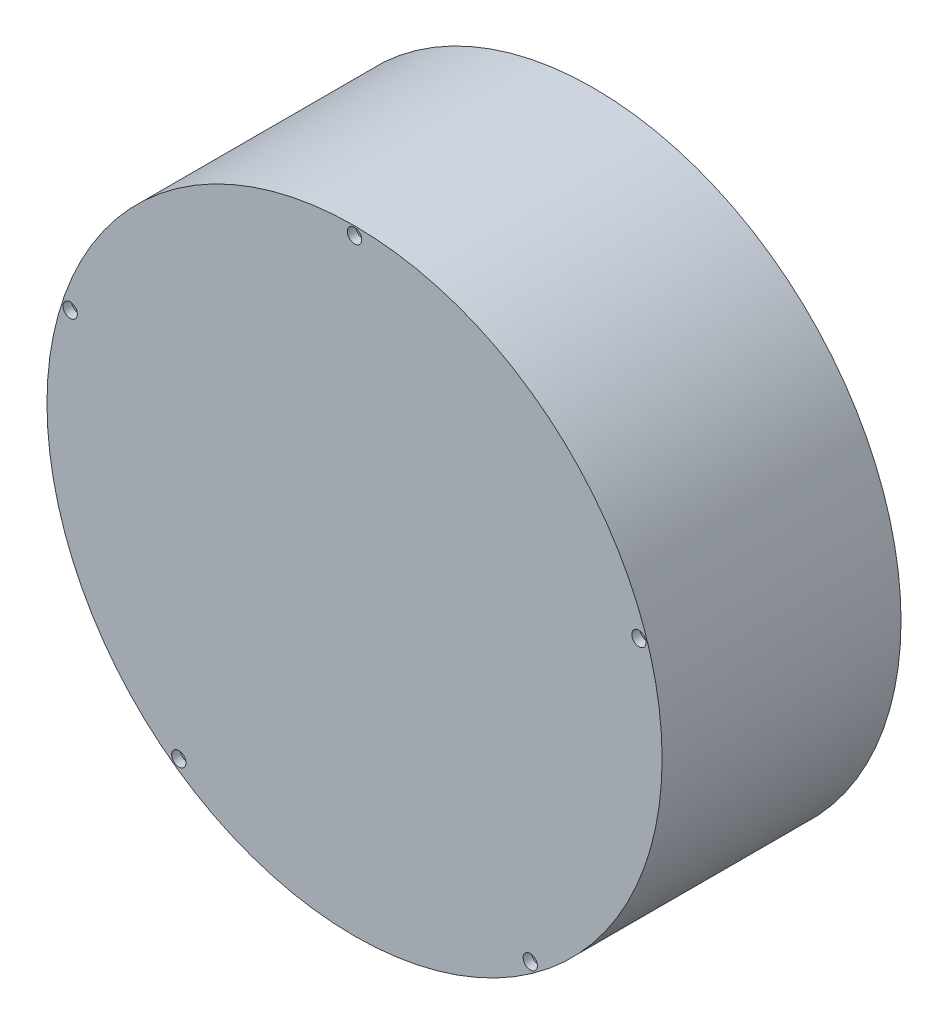
ISO-10303-21;
HEADER;
FILE_DESCRIPTION(('STEP AP214'),'2;1');
FILE_NAME('part.step','',(''),(''),'','','');
FILE_SCHEMA(('AUTOMOTIVE_DESIGN { 1 0 10303 214 1 1 1 1 }'));
ENDSEC;
DATA;
#1=APPLICATION_CONTEXT('core data for automotive mechanical design processes');
#2=APPLICATION_PROTOCOL_DEFINITION('international standard','automotive_design',2000,#1);
#3=PRODUCT_CONTEXT('',#1,'mechanical');
#4=PRODUCT('Part','Part','',(#3));
#5=PRODUCT_RELATED_PRODUCT_CATEGORY('part','',(#4));
#6=PRODUCT_DEFINITION_FORMATION('','',#4);
#7=PRODUCT_DEFINITION_CONTEXT('part definition',#1,'design');
#8=PRODUCT_DEFINITION('design','',#6,#7);
#9=PRODUCT_DEFINITION_SHAPE('','',#8);
#10=(LENGTH_UNIT() NAMED_UNIT(*) SI_UNIT(.MILLI.,.METRE.));
#11=(NAMED_UNIT(*) PLANE_ANGLE_UNIT() SI_UNIT($,.RADIAN.));
#12=(NAMED_UNIT(*) SI_UNIT($,.STERADIAN.) SOLID_ANGLE_UNIT());
#13=UNCERTAINTY_MEASURE_WITH_UNIT(LENGTH_MEASURE(1.E-05),#10,'distance_accuracy_value','');
#14=(GEOMETRIC_REPRESENTATION_CONTEXT(3) GLOBAL_UNCERTAINTY_ASSIGNED_CONTEXT((#13)) GLOBAL_UNIT_ASSIGNED_CONTEXT((#10,
#11,#12)) REPRESENTATION_CONTEXT('',''));
#15=CARTESIAN_POINT('',(0.,0.,0.));
#16=DIRECTION('',(0.,0.,1.));
#17=DIRECTION('',(1.,0.,0.));
#18=AXIS2_PLACEMENT_3D('',#15,#16,#17);
#19=CARTESIAN_POINT('',(122.847117729127,-169.084551824364,167.));
#20=DIRECTION('',(0.,0.,-1.));
#21=DIRECTION('',(-1.,0.,0.));
#22=AXIS2_PLACEMENT_3D('',#19,#20,#21);
#23=CYLINDRICAL_SURFACE('',#22,2.74999999999999);
#24=CARTESIAN_POINT('',(122.847117729127,-169.084551824364,157.));
#25=DIRECTION('',(0.,0.,1.));
#26=DIRECTION('',(1.,0.,0.));
#27=AXIS2_PLACEMENT_3D('',#24,#25,#26);
#28=CIRCLE('',#27,2.74999999999999);
#29=CARTESIAN_POINT('',(125.597117729127,-169.084551824364,157.));
#30=VERTEX_POINT('',#29);
#31=EDGE_CURVE('E70',#30,#30,#28,.T.);
#32=ORIENTED_EDGE('',*,*,#31,.F.);
#33=EDGE_LOOP('',(#32));
#34=FACE_BOUND('',#33,.T.);
#35=CARTESIAN_POINT('',(122.847117729127,-169.084551824364,161.));
#36=DIRECTION('',(0.,0.,1.));
#37=DIRECTION('',(1.,0.,0.));
#38=AXIS2_PLACEMENT_3D('',#35,#36,#37);
#39=CIRCLE('',#38,2.74999999999999);
#40=CARTESIAN_POINT('',(125.597117729127,-169.084551824364,161.));
#41=VERTEX_POINT('',#40);
#42=EDGE_CURVE('E41',#41,#41,#39,.T.);
#43=ORIENTED_EDGE('',*,*,#42,.T.);
#44=EDGE_LOOP('',(#43));
#45=FACE_BOUND('',#44,.T.);
#46=ADVANCED_FACE('F37',(#34,#45),#23,.F.);
#47=CARTESIAN_POINT('',(-122.847117729127,-169.084551824364,167.));
#48=DIRECTION('',(0.,0.,-1.));
#49=DIRECTION('',(-1.,0.,0.));
#50=AXIS2_PLACEMENT_3D('',#47,#48,#49);
#51=CYLINDRICAL_SURFACE('',#50,2.75);
#52=CARTESIAN_POINT('',(-122.847117729127,-169.084551824364,157.));
#53=DIRECTION('',(0.,0.,1.));
#54=DIRECTION('',(1.,0.,0.));
#55=AXIS2_PLACEMENT_3D('',#52,#53,#54);
#56=CIRCLE('',#55,2.75);
#57=CARTESIAN_POINT('',(-120.097117729127,-169.084551824364,157.));
#58=VERTEX_POINT('',#57);
#59=EDGE_CURVE('E74',#58,#58,#56,.T.);
#60=ORIENTED_EDGE('',*,*,#59,.F.);
#61=EDGE_LOOP('',(#60));
#62=FACE_BOUND('',#61,.T.);
#63=CARTESIAN_POINT('',(-122.847117729127,-169.084551824364,161.));
#64=DIRECTION('',(0.,0.,1.));
#65=DIRECTION('',(1.,0.,0.));
#66=AXIS2_PLACEMENT_3D('',#63,#64,#65);
#67=CIRCLE('',#66,2.75);
#68=CARTESIAN_POINT('',(-120.097117729127,-169.084551824364,161.));
#69=VERTEX_POINT('',#68);
#70=EDGE_CURVE('E65',#69,#69,#67,.T.);
#71=ORIENTED_EDGE('',*,*,#70,.T.);
#72=EDGE_LOOP('',(#71));
#73=FACE_BOUND('',#72,.T.);
#74=ADVANCED_FACE('F109',(#62,#73),#51,.F.);
#75=CARTESIAN_POINT('',(-198.770811905687,64.584551824364,167.));
#76=DIRECTION('',(0.,0.,-1.));
#77=DIRECTION('',(-1.,0.,0.));
#78=AXIS2_PLACEMENT_3D('',#75,#76,#77);
#79=CYLINDRICAL_SURFACE('',#78,2.75);
#80=CARTESIAN_POINT('',(-198.770811905687,64.584551824364,157.));
#81=DIRECTION('',(0.,0.,1.));
#82=DIRECTION('',(1.,0.,0.));
#83=AXIS2_PLACEMENT_3D('',#80,#81,#82);
#84=CIRCLE('',#83,2.75);
#85=CARTESIAN_POINT('',(-196.020811905687,64.584551824364,157.));
#86=VERTEX_POINT('',#85);
#87=EDGE_CURVE('E79',#86,#86,#84,.T.);
#88=ORIENTED_EDGE('',*,*,#87,.F.);
#89=EDGE_LOOP('',(#88));
#90=FACE_BOUND('',#89,.T.);
#91=CARTESIAN_POINT('',(-198.770811905687,64.584551824364,161.));
#92=DIRECTION('',(0.,0.,1.));
#93=DIRECTION('',(1.,0.,0.));
#94=AXIS2_PLACEMENT_3D('',#91,#92,#93);
#95=CIRCLE('',#94,2.75);
#96=CARTESIAN_POINT('',(-196.020811905687,64.584551824364,161.));
#97=VERTEX_POINT('',#96);
#98=EDGE_CURVE('E63',#97,#97,#95,.T.);
#99=ORIENTED_EDGE('',*,*,#98,.T.);
#100=EDGE_LOOP('',(#99));
#101=FACE_BOUND('',#100,.T.);
#102=ADVANCED_FACE('F105',(#90,#101),#79,.F.);
#103=CARTESIAN_POINT('',(0.,209.,167.));
#104=DIRECTION('',(0.,0.,-1.));
#105=DIRECTION('',(-1.,0.,0.));
#106=AXIS2_PLACEMENT_3D('',#103,#104,#105);
#107=CYLINDRICAL_SURFACE('',#106,2.75);
#108=CARTESIAN_POINT('',(0.,209.,157.));
#109=DIRECTION('',(0.,0.,1.));
#110=DIRECTION('',(1.,0.,0.));
#111=AXIS2_PLACEMENT_3D('',#108,#109,#110);
#112=CIRCLE('',#111,2.75);
#113=CARTESIAN_POINT('',(2.75000000000001,209.,157.));
#114=VERTEX_POINT('',#113);
#115=EDGE_CURVE('E90',#114,#114,#112,.T.);
#116=ORIENTED_EDGE('',*,*,#115,.F.);
#117=EDGE_LOOP('',(#116));
#118=FACE_BOUND('',#117,.T.);
#119=CARTESIAN_POINT('',(0.,209.,161.));
#120=DIRECTION('',(0.,0.,1.));
#121=DIRECTION('',(1.,0.,0.));
#122=AXIS2_PLACEMENT_3D('',#119,#120,#121);
#123=CIRCLE('',#122,2.75);
#124=CARTESIAN_POINT('',(2.75000000000001,209.,161.));
#125=VERTEX_POINT('',#124);
#126=EDGE_CURVE('E59',#125,#125,#123,.T.);
#127=ORIENTED_EDGE('',*,*,#126,.T.);
#128=EDGE_LOOP('',(#127));
#129=FACE_BOUND('',#128,.T.);
#130=ADVANCED_FACE('F108',(#118,#129),#107,.F.);
#131=CARTESIAN_POINT('',(198.770811905687,64.584551824364,167.));
#132=DIRECTION('',(0.,0.,-1.));
#133=DIRECTION('',(-1.,0.,0.));
#134=AXIS2_PLACEMENT_3D('',#131,#132,#133);
#135=CYLINDRICAL_SURFACE('',#134,2.75);
#136=CARTESIAN_POINT('',(198.770811905687,64.584551824364,157.));
#137=DIRECTION('',(0.,0.,1.));
#138=DIRECTION('',(1.,0.,0.));
#139=AXIS2_PLACEMENT_3D('',#136,#137,#138);
#140=CIRCLE('',#139,2.75);
#141=CARTESIAN_POINT('',(201.520811905687,64.584551824364,157.));
#142=VERTEX_POINT('',#141);
#143=EDGE_CURVE('E86',#142,#142,#140,.T.);
#144=ORIENTED_EDGE('',*,*,#143,.F.);
#145=EDGE_LOOP('',(#144));
#146=FACE_BOUND('',#145,.T.);
#147=CARTESIAN_POINT('',(198.770811905687,64.584551824364,161.));
#148=DIRECTION('',(0.,0.,1.));
#149=DIRECTION('',(1.,0.,0.));
#150=AXIS2_PLACEMENT_3D('',#147,#148,#149);
#151=CIRCLE('',#150,2.75);
#152=CARTESIAN_POINT('',(201.520811905687,64.584551824364,161.));
#153=VERTEX_POINT('',#152);
#154=EDGE_CURVE('E56',#153,#153,#151,.T.);
#155=ORIENTED_EDGE('',*,*,#154,.T.);
#156=EDGE_LOOP('',(#155));
#157=FACE_BOUND('',#156,.T.);
#158=ADVANCED_FACE('F160',(#146,#157),#135,.F.);
#159=CARTESIAN_POINT('',(0.,0.,167.));
#160=DIRECTION('',(0.,0.,-1.));
#161=DIRECTION('',(-1.,0.,0.));
#162=AXIS2_PLACEMENT_3D('',#159,#160,#161);
#163=CYLINDRICAL_SURFACE('',#162,215.);
#164=CARTESIAN_POINT('',(0.,0.,167.));
#165=DIRECTION('',(0.,0.,1.));
#166=DIRECTION('',(1.,0.,0.));
#167=AXIS2_PLACEMENT_3D('',#164,#165,#166);
#168=CIRCLE('',#167,215.);
#169=CARTESIAN_POINT('',(-215.,0.,167.));
#170=VERTEX_POINT('',#169);
#171=EDGE_CURVE('E10',#170,#170,#168,.T.);
#172=CARTESIAN_POINT('',(0.,0.,0.));
#173=DIRECTION('',(0.,0.,1.));
#174=DIRECTION('',(1.,0.,0.));
#175=AXIS2_PLACEMENT_3D('',#172,#173,#174);
#176=CIRCLE('',#175,215.);
#177=CARTESIAN_POINT('',(-215.,0.,0.));
#178=VERTEX_POINT('',#177);
#179=EDGE_CURVE('E45',#178,#178,#176,.T.);
#180=CARTESIAN_POINT('',(-215.,0.,167.));
#181=CARTESIAN_POINT('',(-215.,0.,165.260416666667));
#182=CARTESIAN_POINT('',(-215.,0.,163.520833333333));
#183=CARTESIAN_POINT('',(-215.,0.,160.041666666667));
#184=CARTESIAN_POINT('',(-215.,0.,158.302083333333));
#185=CARTESIAN_POINT('',(-215.,0.,154.822916666667));
#186=CARTESIAN_POINT('',(-215.,0.,153.083333333333));
#187=CARTESIAN_POINT('',(-215.,0.,149.604166666667));
#188=CARTESIAN_POINT('',(-215.,0.,147.864583333333));
#189=CARTESIAN_POINT('',(-215.,0.,144.385416666667));
#190=CARTESIAN_POINT('',(-215.,0.,142.645833333333));
#191=CARTESIAN_POINT('',(-215.,0.,139.166666666667));
#192=CARTESIAN_POINT('',(-215.,0.,137.427083333333));
#193=CARTESIAN_POINT('',(-215.,0.,133.947916666667));
#194=CARTESIAN_POINT('',(-215.,0.,132.208333333333));
#195=CARTESIAN_POINT('',(-215.,0.,128.729166666667));
#196=CARTESIAN_POINT('',(-215.,0.,126.989583333333));
#197=CARTESIAN_POINT('',(-215.,0.,123.510416666667));
#198=CARTESIAN_POINT('',(-215.,0.,121.770833333333));
#199=CARTESIAN_POINT('',(-215.,0.,118.291666666667));
#200=CARTESIAN_POINT('',(-215.,0.,116.552083333333));
#201=CARTESIAN_POINT('',(-215.,0.,113.072916666667));
#202=CARTESIAN_POINT('',(-215.,0.,111.333333333333));
#203=CARTESIAN_POINT('',(-215.,0.,107.854166666667));
#204=CARTESIAN_POINT('',(-215.,0.,106.114583333333));
#205=CARTESIAN_POINT('',(-215.,0.,102.635416666667));
#206=CARTESIAN_POINT('',(-215.,0.,100.895833333333));
#207=CARTESIAN_POINT('',(-215.,0.,97.4166666666667));
#208=CARTESIAN_POINT('',(-215.,0.,95.6770833333333));
#209=CARTESIAN_POINT('',(-215.,0.,92.1979166666667));
#210=CARTESIAN_POINT('',(-215.,0.,90.4583333333333));
#211=CARTESIAN_POINT('',(-215.,0.,86.9791666666666));
#212=CARTESIAN_POINT('',(-215.,0.,85.2395833333333));
#213=CARTESIAN_POINT('',(-215.,0.,81.7604166666667));
#214=CARTESIAN_POINT('',(-215.,0.,80.0208333333333));
#215=CARTESIAN_POINT('',(-215.,0.,76.5416666666667));
#216=CARTESIAN_POINT('',(-215.,0.,74.8020833333333));
#217=CARTESIAN_POINT('',(-215.,0.,71.3229166666667));
#218=CARTESIAN_POINT('',(-215.,0.,69.5833333333333));
#219=CARTESIAN_POINT('',(-215.,0.,66.1041666666666));
#220=CARTESIAN_POINT('',(-215.,0.,64.3645833333333));
#221=CARTESIAN_POINT('',(-215.,0.,60.8854166666667));
#222=CARTESIAN_POINT('',(-215.,0.,59.1458333333333));
#223=CARTESIAN_POINT('',(-215.,0.,55.6666666666667));
#224=CARTESIAN_POINT('',(-215.,0.,53.9270833333333));
#225=CARTESIAN_POINT('',(-215.,0.,50.4479166666667));
#226=CARTESIAN_POINT('',(-215.,0.,48.7083333333333));
#227=CARTESIAN_POINT('',(-215.,0.,45.2291666666667));
#228=CARTESIAN_POINT('',(-215.,0.,43.4895833333333));
#229=CARTESIAN_POINT('',(-215.,0.,40.0104166666667));
#230=CARTESIAN_POINT('',(-215.,0.,38.2708333333333));
#231=CARTESIAN_POINT('',(-215.,0.,34.7916666666667));
#232=CARTESIAN_POINT('',(-215.,0.,33.0520833333333));
#233=CARTESIAN_POINT('',(-215.,0.,29.5729166666667));
#234=CARTESIAN_POINT('',(-215.,0.,27.8333333333333));
#235=CARTESIAN_POINT('',(-215.,0.,24.3541666666667));
#236=CARTESIAN_POINT('',(-215.,0.,22.6145833333333));
#237=CARTESIAN_POINT('',(-215.,0.,19.1354166666667));
#238=CARTESIAN_POINT('',(-215.,0.,17.3958333333333));
#239=CARTESIAN_POINT('',(-215.,0.,13.9166666666667));
#240=CARTESIAN_POINT('',(-215.,0.,12.1770833333333));
#241=CARTESIAN_POINT('',(-215.,0.,8.69791666666666));
#242=CARTESIAN_POINT('',(-215.,0.,6.95833333333333));
#243=CARTESIAN_POINT('',(-215.,0.,3.47916666666666));
#244=CARTESIAN_POINT('',(-215.,0.,1.73958333333333));
#245=CARTESIAN_POINT('',(-215.,0.,0.));
#246=B_SPLINE_CURVE_WITH_KNOTS('',3,(#180,#181,#182,#183,#184,#185,#186,#187,#188,#189,#190,
#191,#192,#193,#194,#195,#196,#197,#198,#199,#200,#201,#202,#203,#204,#205,#206,#207,#208,#209,
#210,#211,#212,#213,#214,#215,#216,#217,#218,#219,#220,#221,#222,#223,#224,#225,#226,#227,#228,
#229,#230,#231,#232,#233,#234,#235,#236,#237,#238,#239,#240,#241,#242,#243,#244,#245),
.UNSPECIFIED.,.F.,.F.,(4,2,2,2,2,2,2,2,2,2,2,2,2,2,2,2,2,2,2,2,2,2,2,2,2,2,2,2,2,2,2,2,4),(0.,
5.21875000000002,10.4375,15.65625,20.875,26.09375,31.3125,36.53125,41.75,46.96875,52.1875,
57.40625,62.625,67.84375,73.0625,78.28125,83.5,88.71875,93.9375,99.15625,104.375,109.59375,
114.8125,120.03125,125.25,130.46875,135.6875,140.90625,146.125,151.34375,156.5625,161.78125,
167.),.UNSPECIFIED.);
#247=EDGE_CURVE('BSEAM39',#170,#178,#246,.T.);
#248=ORIENTED_EDGE('',*,*,#171,.F.);
#249=ORIENTED_EDGE('',*,*,#179,.T.);
#250=ORIENTED_EDGE('',*,*,#247,.T.);
#251=ORIENTED_EDGE('',*,*,#247,.F.);
#252=EDGE_LOOP('',(#248,#250,#249,#251));
#253=FACE_BOUND('',#252,.T.);
#254=ADVANCED_FACE('F39',(#253),#163,.T.);
#255=CARTESIAN_POINT('',(0.,0.,167.));
#256=DIRECTION('',(0.,0.,1.));
#257=DIRECTION('',(1.,0.,0.));
#258=AXIS2_PLACEMENT_3D('',#255,#256,#257);
#259=PLANE('',#258);
#260=CARTESIAN_POINT('',(198.770811905687,64.584551824364,167.));
#261=DIRECTION('',(0.,0.,1.));
#262=DIRECTION('',(1.,0.,0.));
#263=AXIS2_PLACEMENT_3D('',#260,#261,#262);
#264=CIRCLE('',#263,5.);
#265=CARTESIAN_POINT('',(203.770811905687,64.584551824364,167.));
#266=VERTEX_POINT('',#265);
#267=EDGE_CURVE('E60',#266,#266,#264,.T.);
#268=ORIENTED_EDGE('',*,*,#267,.F.);
#269=EDGE_LOOP('',(#268));
#270=FACE_BOUND('',#269,.T.);
#271=CARTESIAN_POINT('',(0.,209.,167.));
#272=DIRECTION('',(0.,0.,1.));
#273=DIRECTION('',(1.,0.,0.));
#274=AXIS2_PLACEMENT_3D('',#271,#272,#273);
#275=CIRCLE('',#274,5.);
#276=CARTESIAN_POINT('',(5.00000000000001,209.,167.));
#277=VERTEX_POINT('',#276);
#278=EDGE_CURVE('E123',#277,#277,#275,.T.);
#279=ORIENTED_EDGE('',*,*,#278,.F.);
#280=EDGE_LOOP('',(#279));
#281=FACE_BOUND('',#280,.T.);
#282=CARTESIAN_POINT('',(-198.770811905687,64.584551824364,167.));
#283=DIRECTION('',(0.,0.,1.));
#284=DIRECTION('',(1.,0.,0.));
#285=AXIS2_PLACEMENT_3D('',#282,#283,#284);
#286=CIRCLE('',#285,5.);
#287=CARTESIAN_POINT('',(-193.770811905687,64.584551824364,167.));
#288=VERTEX_POINT('',#287);
#289=EDGE_CURVE('E124',#288,#288,#286,.T.);
#290=ORIENTED_EDGE('',*,*,#289,.F.);
#291=EDGE_LOOP('',(#290));
#292=FACE_BOUND('',#291,.T.);
#293=CARTESIAN_POINT('',(-122.847117729127,-169.084551824364,167.));
#294=DIRECTION('',(0.,0.,1.));
#295=DIRECTION('',(1.,0.,0.));
#296=AXIS2_PLACEMENT_3D('',#293,#294,#295);
#297=CIRCLE('',#296,5.);
#298=CARTESIAN_POINT('',(-117.847117729127,-169.084551824364,167.));
#299=VERTEX_POINT('',#298);
#300=EDGE_CURVE('E136',#299,#299,#297,.T.);
#301=ORIENTED_EDGE('',*,*,#300,.F.);
#302=EDGE_LOOP('',(#301));
#303=FACE_BOUND('',#302,.T.);
#304=CARTESIAN_POINT('',(122.847117729127,-169.084551824364,167.));
#305=DIRECTION('',(0.,0.,1.));
#306=DIRECTION('',(1.,0.,0.));
#307=AXIS2_PLACEMENT_3D('',#304,#305,#306);
#308=CIRCLE('',#307,4.99999999999999);
#309=CARTESIAN_POINT('',(127.847117729127,-169.084551824364,167.));
#310=VERTEX_POINT('',#309);
#311=EDGE_CURVE('E97',#310,#310,#308,.T.);
#312=ORIENTED_EDGE('',*,*,#311,.F.);
#313=EDGE_LOOP('',(#312));
#314=FACE_BOUND('',#313,.T.);
#315=ORIENTED_EDGE('',*,*,#171,.T.);
#316=EDGE_LOOP('',(#315));
#317=FACE_BOUND('',#316,.T.);
#318=ADVANCED_FACE('F148',(#270,#281,#292,#303,#314,#317),#259,.T.);
#319=CARTESIAN_POINT('',(0.,0.,0.));
#320=DIRECTION('',(0.,0.,1.));
#321=DIRECTION('',(1.,0.,0.));
#322=AXIS2_PLACEMENT_3D('',#319,#320,#321);
#323=PLANE('',#322);
#324=CARTESIAN_POINT('',(0.,0.,0.));
#325=DIRECTION('',(0.,0.,1.));
#326=DIRECTION('',(1.,0.,0.));
#327=AXIS2_PLACEMENT_3D('',#324,#325,#326);
#328=CIRCLE('',#327,212.);
#329=CARTESIAN_POINT('',(212.,0.,0.));
#330=VERTEX_POINT('',#329);
#331=EDGE_CURVE('E53',#330,#330,#328,.T.);
#332=ORIENTED_EDGE('',*,*,#331,.T.);
#333=EDGE_LOOP('',(#332));
#334=FACE_BOUND('',#333,.T.);
#335=ORIENTED_EDGE('',*,*,#179,.F.);
#336=EDGE_LOOP('',(#335));
#337=FACE_BOUND('',#336,.T.);
#338=ADVANCED_FACE('F150',(#334,#337),#323,.F.);
#339=CARTESIAN_POINT('',(0.,0.,157.));
#340=DIRECTION('',(0.,0.,-1.));
#341=DIRECTION('',(-1.,0.,0.));
#342=AXIS2_PLACEMENT_3D('',#339,#340,#341);
#343=CYLINDRICAL_SURFACE('',#342,212.);
#344=CARTESIAN_POINT('',(0.,0.,157.));
#345=DIRECTION('',(0.,0.,1.));
#346=DIRECTION('',(1.,0.,0.));
#347=AXIS2_PLACEMENT_3D('',#344,#345,#346);
#348=CIRCLE('',#347,212.);
#349=CARTESIAN_POINT('',(212.,0.,157.));
#350=VERTEX_POINT('',#349);
#351=EDGE_CURVE('E50',#350,#350,#348,.T.);
#352=ORIENTED_EDGE('',*,*,#351,.T.);
#353=EDGE_LOOP('',(#352));
#354=FACE_BOUND('',#353,.T.);
#355=ORIENTED_EDGE('',*,*,#331,.F.);
#356=EDGE_LOOP('',(#355));
#357=FACE_BOUND('',#356,.T.);
#358=ADVANCED_FACE('F158',(#354,#357),#343,.F.);
#359=CARTESIAN_POINT('',(0.,0.,157.));
#360=DIRECTION('',(0.,0.,1.));
#361=DIRECTION('',(1.,0.,0.));
#362=AXIS2_PLACEMENT_3D('',#359,#360,#361);
#363=PLANE('',#362);
#364=ORIENTED_EDGE('',*,*,#143,.T.);
#365=EDGE_LOOP('',(#364));
#366=FACE_BOUND('',#365,.T.);
#367=ORIENTED_EDGE('',*,*,#115,.T.);
#368=EDGE_LOOP('',(#367));
#369=FACE_BOUND('',#368,.T.);
#370=ORIENTED_EDGE('',*,*,#87,.T.);
#371=EDGE_LOOP('',(#370));
#372=FACE_BOUND('',#371,.T.);
#373=ORIENTED_EDGE('',*,*,#59,.T.);
#374=EDGE_LOOP('',(#373));
#375=FACE_BOUND('',#374,.T.);
#376=ORIENTED_EDGE('',*,*,#31,.T.);
#377=EDGE_LOOP('',(#376));
#378=FACE_BOUND('',#377,.T.);
#379=ORIENTED_EDGE('',*,*,#351,.F.);
#380=EDGE_LOOP('',(#379));
#381=FACE_BOUND('',#380,.T.);
#382=ADVANCED_FACE('F102',(#366,#369,#372,#375,#378,#381),#363,.F.);
#383=CARTESIAN_POINT('',(198.770811905687,64.584551824364,167.));
#384=DIRECTION('',(0.,0.,-1.));
#385=DIRECTION('',(-1.,0.,0.));
#386=AXIS2_PLACEMENT_3D('',#383,#384,#385);
#387=CYLINDRICAL_SURFACE('',#386,5.);
#388=ORIENTED_EDGE('',*,*,#267,.T.);
#389=EDGE_LOOP('',(#388));
#390=FACE_BOUND('',#389,.T.);
#391=CARTESIAN_POINT('',(198.770811905687,64.584551824364,161.));
#392=DIRECTION('',(0.,0.,1.));
#393=DIRECTION('',(1.,0.,0.));
#394=AXIS2_PLACEMENT_3D('',#391,#392,#393);
#395=CIRCLE('',#394,5.);
#396=CARTESIAN_POINT('',(203.770811905687,64.584551824364,161.));
#397=VERTEX_POINT('',#396);
#398=EDGE_CURVE('E322',#397,#397,#395,.T.);
#399=ORIENTED_EDGE('',*,*,#398,.F.);
#400=EDGE_LOOP('',(#399));
#401=FACE_BOUND('',#400,.T.);
#402=ADVANCED_FACE('F175',(#390,#401),#387,.F.);
#403=CARTESIAN_POINT('',(198.770811905687,64.584551824364,161.));
#404=DIRECTION('',(0.,0.,1.));
#405=DIRECTION('',(1.,0.,0.));
#406=AXIS2_PLACEMENT_3D('',#403,#404,#405);
#407=PLANE('',#406);
#408=ORIENTED_EDGE('',*,*,#154,.F.);
#409=EDGE_LOOP('',(#408));
#410=FACE_BOUND('',#409,.T.);
#411=ORIENTED_EDGE('',*,*,#398,.T.);
#412=EDGE_LOOP('',(#411));
#413=FACE_BOUND('',#412,.T.);
#414=ADVANCED_FACE('F225',(#410,#413),#407,.T.);
#415=CARTESIAN_POINT('',(0.,209.,167.));
#416=DIRECTION('',(0.,0.,-1.));
#417=DIRECTION('',(-1.,0.,0.));
#418=AXIS2_PLACEMENT_3D('',#415,#416,#417);
#419=CYLINDRICAL_SURFACE('',#418,5.);
#420=ORIENTED_EDGE('',*,*,#278,.T.);
#421=EDGE_LOOP('',(#420));
#422=FACE_BOUND('',#421,.T.);
#423=CARTESIAN_POINT('',(0.,209.,161.));
#424=DIRECTION('',(0.,0.,1.));
#425=DIRECTION('',(1.,0.,0.));
#426=AXIS2_PLACEMENT_3D('',#423,#424,#425);
#427=CIRCLE('',#426,5.);
#428=CARTESIAN_POINT('',(5.00000000000001,209.,161.));
#429=VERTEX_POINT('',#428);
#430=EDGE_CURVE('E127',#429,#429,#427,.T.);
#431=ORIENTED_EDGE('',*,*,#430,.F.);
#432=EDGE_LOOP('',(#431));
#433=FACE_BOUND('',#432,.T.);
#434=ADVANCED_FACE('F235',(#422,#433),#419,.F.);
#435=CARTESIAN_POINT('',(0.,209.,161.));
#436=DIRECTION('',(0.,0.,1.));
#437=DIRECTION('',(1.,0.,0.));
#438=AXIS2_PLACEMENT_3D('',#435,#436,#437);
#439=PLANE('',#438);
#440=ORIENTED_EDGE('',*,*,#126,.F.);
#441=EDGE_LOOP('',(#440));
#442=FACE_BOUND('',#441,.T.);
#443=ORIENTED_EDGE('',*,*,#430,.T.);
#444=EDGE_LOOP('',(#443));
#445=FACE_BOUND('',#444,.T.);
#446=ADVANCED_FACE('F245',(#442,#445),#439,.T.);
#447=CARTESIAN_POINT('',(-198.770811905687,64.584551824364,167.));
#448=DIRECTION('',(0.,0.,-1.));
#449=DIRECTION('',(-1.,0.,0.));
#450=AXIS2_PLACEMENT_3D('',#447,#448,#449);
#451=CYLINDRICAL_SURFACE('',#450,5.);
#452=ORIENTED_EDGE('',*,*,#289,.T.);
#453=EDGE_LOOP('',(#452));
#454=FACE_BOUND('',#453,.T.);
#455=CARTESIAN_POINT('',(-198.770811905687,64.584551824364,161.));
#456=DIRECTION('',(0.,0.,1.));
#457=DIRECTION('',(1.,0.,0.));
#458=AXIS2_PLACEMENT_3D('',#455,#456,#457);
#459=CIRCLE('',#458,5.);
#460=CARTESIAN_POINT('',(-193.770811905687,64.584551824364,161.));
#461=VERTEX_POINT('',#460);
#462=EDGE_CURVE('E121',#461,#461,#459,.T.);
#463=ORIENTED_EDGE('',*,*,#462,.F.);
#464=EDGE_LOOP('',(#463));
#465=FACE_BOUND('',#464,.T.);
#466=ADVANCED_FACE('F117',(#454,#465),#451,.F.);
#467=CARTESIAN_POINT('',(-198.770811905687,64.584551824364,161.));
#468=DIRECTION('',(0.,0.,1.));
#469=DIRECTION('',(1.,0.,0.));
#470=AXIS2_PLACEMENT_3D('',#467,#468,#469);
#471=PLANE('',#470);
#472=ORIENTED_EDGE('',*,*,#98,.F.);
#473=EDGE_LOOP('',(#472));
#474=FACE_BOUND('',#473,.T.);
#475=ORIENTED_EDGE('',*,*,#462,.T.);
#476=EDGE_LOOP('',(#475));
#477=FACE_BOUND('',#476,.T.);
#478=ADVANCED_FACE('F113',(#474,#477),#471,.T.);
#479=CARTESIAN_POINT('',(-122.847117729127,-169.084551824364,167.));
#480=DIRECTION('',(0.,0.,-1.));
#481=DIRECTION('',(-1.,0.,0.));
#482=AXIS2_PLACEMENT_3D('',#479,#480,#481);
#483=CYLINDRICAL_SURFACE('',#482,5.);
#484=ORIENTED_EDGE('',*,*,#300,.T.);
#485=EDGE_LOOP('',(#484));
#486=FACE_BOUND('',#485,.T.);
#487=CARTESIAN_POINT('',(-122.847117729127,-169.084551824364,161.));
#488=DIRECTION('',(0.,0.,1.));
#489=DIRECTION('',(1.,0.,0.));
#490=AXIS2_PLACEMENT_3D('',#487,#488,#489);
#491=CIRCLE('',#490,5.);
#492=CARTESIAN_POINT('',(-117.847117729127,-169.084551824364,161.));
#493=VERTEX_POINT('',#492);
#494=EDGE_CURVE('E130',#493,#493,#491,.T.);
#495=ORIENTED_EDGE('',*,*,#494,.F.);
#496=EDGE_LOOP('',(#495));
#497=FACE_BOUND('',#496,.T.);
#498=ADVANCED_FACE('F116',(#486,#497),#483,.F.);
#499=CARTESIAN_POINT('',(-122.847117729127,-169.084551824364,161.));
#500=DIRECTION('',(0.,0.,1.));
#501=DIRECTION('',(1.,0.,0.));
#502=AXIS2_PLACEMENT_3D('',#499,#500,#501);
#503=PLANE('',#502);
#504=ORIENTED_EDGE('',*,*,#70,.F.);
#505=EDGE_LOOP('',(#504));
#506=FACE_BOUND('',#505,.T.);
#507=ORIENTED_EDGE('',*,*,#494,.T.);
#508=EDGE_LOOP('',(#507));
#509=FACE_BOUND('',#508,.T.);
#510=ADVANCED_FACE('F279',(#506,#509),#503,.T.);
#511=CARTESIAN_POINT('',(122.847117729127,-169.084551824364,167.));
#512=DIRECTION('',(0.,0.,-1.));
#513=DIRECTION('',(-1.,0.,0.));
#514=AXIS2_PLACEMENT_3D('',#511,#512,#513);
#515=CYLINDRICAL_SURFACE('',#514,4.99999999999999);
#516=ORIENTED_EDGE('',*,*,#311,.T.);
#517=EDGE_LOOP('',(#516));
#518=FACE_BOUND('',#517,.T.);
#519=CARTESIAN_POINT('',(122.847117729127,-169.084551824364,161.));
#520=DIRECTION('',(0.,0.,1.));
#521=DIRECTION('',(1.,0.,0.));
#522=AXIS2_PLACEMENT_3D('',#519,#520,#521);
#523=CIRCLE('',#522,4.99999999999999);
#524=CARTESIAN_POINT('',(127.847117729127,-169.084551824364,161.));
#525=VERTEX_POINT('',#524);
#526=EDGE_CURVE('E138',#525,#525,#523,.T.);
#527=ORIENTED_EDGE('',*,*,#526,.F.);
#528=EDGE_LOOP('',(#527));
#529=FACE_BOUND('',#528,.T.);
#530=ADVANCED_FACE('F145',(#518,#529),#515,.F.);
#531=CARTESIAN_POINT('',(122.847117729127,-169.084551824364,161.));
#532=DIRECTION('',(0.,0.,1.));
#533=DIRECTION('',(1.,0.,0.));
#534=AXIS2_PLACEMENT_3D('',#531,#532,#533);
#535=PLANE('',#534);
#536=ORIENTED_EDGE('',*,*,#42,.F.);
#537=EDGE_LOOP('',(#536));
#538=FACE_BOUND('',#537,.T.);
#539=ORIENTED_EDGE('',*,*,#526,.T.);
#540=EDGE_LOOP('',(#539));
#541=FACE_BOUND('',#540,.T.);
#542=ADVANCED_FACE('F298',(#538,#541),#535,.T.);
#543=CLOSED_SHELL('',(#46,#74,#102,#130,#158,#254,#318,#338,#358,#382,#402,#414,#434,#446,#466,
#478,#498,#510,#530,#542));
#544=MANIFOLD_SOLID_BREP('B2',#543);
#545=ADVANCED_BREP_SHAPE_REPRESENTATION('',(#18,#544),#14);
#546=SHAPE_DEFINITION_REPRESENTATION(#9,#545);
ENDSEC;
END-ISO-10303-21;
